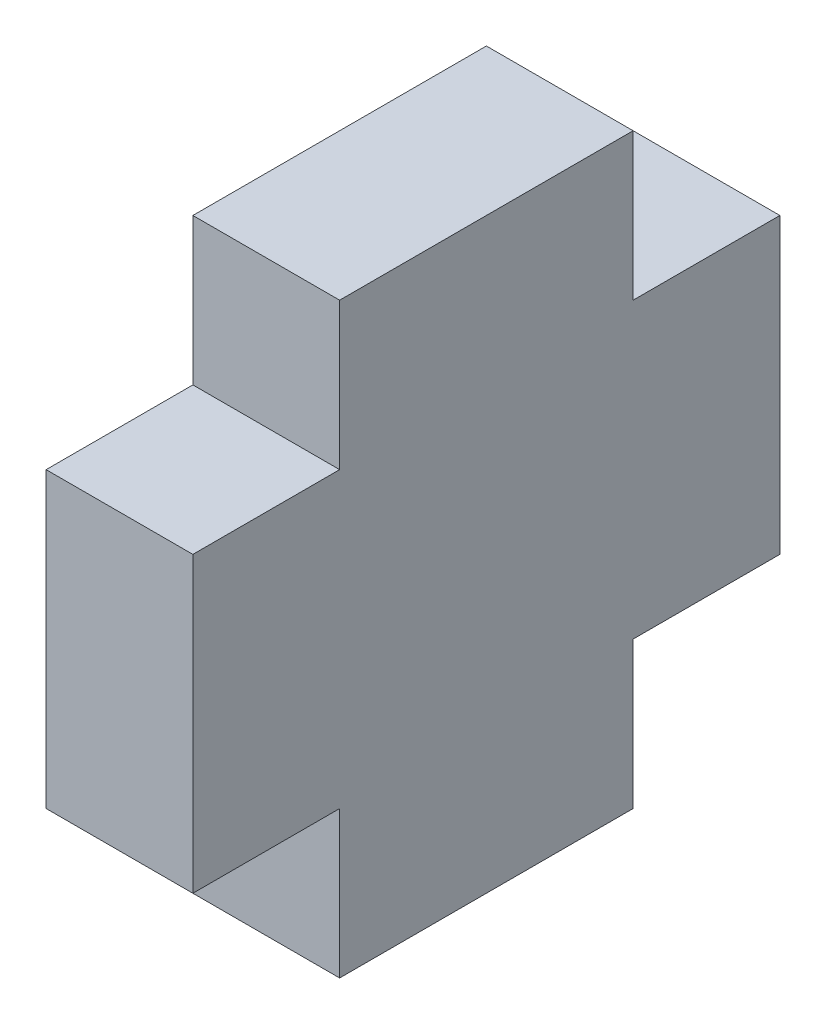
ISO-10303-21;
HEADER;
FILE_DESCRIPTION(('STEP AP214'),'2;1');
FILE_NAME('part.step','',(''),(''),'','','');
FILE_SCHEMA(('AUTOMOTIVE_DESIGN { 1 0 10303 214 1 1 1 1 }'));
ENDSEC;
DATA;
#1=APPLICATION_CONTEXT('core data for automotive mechanical design processes');
#2=APPLICATION_PROTOCOL_DEFINITION('international standard','automotive_design',2000,#1);
#3=PRODUCT_CONTEXT('',#1,'mechanical');
#4=PRODUCT('Part','Part','',(#3));
#5=PRODUCT_RELATED_PRODUCT_CATEGORY('part','',(#4));
#6=PRODUCT_DEFINITION_FORMATION('','',#4);
#7=PRODUCT_DEFINITION_CONTEXT('part definition',#1,'design');
#8=PRODUCT_DEFINITION('design','',#6,#7);
#9=PRODUCT_DEFINITION_SHAPE('','',#8);
#10=(LENGTH_UNIT() NAMED_UNIT(*) SI_UNIT(.MILLI.,.METRE.));
#11=(NAMED_UNIT(*) PLANE_ANGLE_UNIT() SI_UNIT($,.RADIAN.));
#12=(NAMED_UNIT(*) SI_UNIT($,.STERADIAN.) SOLID_ANGLE_UNIT());
#13=UNCERTAINTY_MEASURE_WITH_UNIT(LENGTH_MEASURE(1.E-05),#10,'distance_accuracy_value','');
#14=(GEOMETRIC_REPRESENTATION_CONTEXT(3) GLOBAL_UNCERTAINTY_ASSIGNED_CONTEXT((#13)) GLOBAL_UNIT_ASSIGNED_CONTEXT((#10,
#11,#12)) REPRESENTATION_CONTEXT('',''));
#15=CARTESIAN_POINT('',(0.,0.,0.));
#16=DIRECTION('',(0.,0.,1.));
#17=DIRECTION('',(1.,0.,0.));
#18=AXIS2_PLACEMENT_3D('',#15,#16,#17);
#19=CARTESIAN_POINT('',(10.,20.,10.));
#20=DIRECTION('',(0.,0.,-1.));
#21=DIRECTION('',(0.,1.,0.));
#22=AXIS2_PLACEMENT_3D('',#19,#20,#21);
#23=PLANE('',#22);
#24=DIRECTION('',(0.,-1.,0.));
#25=VECTOR('',#24,1.);
#26=CARTESIAN_POINT('',(0.,20.,10.));
#27=LINE('',#26,#25);
#28=CARTESIAN_POINT('',(0.,20.,10.));
#29=VERTEX_POINT('',#28);
#30=CARTESIAN_POINT('',(0.,9.99999999999999,10.));
#31=VERTEX_POINT('',#30);
#32=EDGE_CURVE('E164',#29,#31,#27,.T.);
#33=ORIENTED_EDGE('',*,*,#32,.T.);
#34=DIRECTION('',(-1.,0.,0.));
#35=VECTOR('',#34,1.);
#36=CARTESIAN_POINT('',(10.,9.99999999999999,10.));
#37=LINE('',#36,#35);
#38=CARTESIAN_POINT('',(10.,9.99999999999999,10.));
#39=VERTEX_POINT('',#38);
#40=EDGE_CURVE('E11',#39,#31,#37,.T.);
#41=ORIENTED_EDGE('',*,*,#40,.F.);
#42=DIRECTION('',(0.,-1.,0.));
#43=VECTOR('',#42,1.);
#44=CARTESIAN_POINT('',(10.,20.,10.));
#45=LINE('',#44,#43);
#46=CARTESIAN_POINT('',(10.,20.,10.));
#47=VERTEX_POINT('',#46);
#48=EDGE_CURVE('E198',#47,#39,#45,.T.);
#49=ORIENTED_EDGE('',*,*,#48,.F.);
#50=DIRECTION('',(-1.,0.,0.));
#51=VECTOR('',#50,1.);
#52=CARTESIAN_POINT('',(10.,20.,10.));
#53=LINE('',#52,#51);
#54=EDGE_CURVE('E160',#47,#29,#53,.T.);
#55=ORIENTED_EDGE('',*,*,#54,.T.);
#56=EDGE_LOOP('',(#33,#41,#49,#55));
#57=FACE_BOUND('',#56,.T.);
#58=ADVANCED_FACE('F39',(#57),#23,.F.);
#59=CARTESIAN_POINT('',(10.,9.99999999999999,10.));
#60=DIRECTION('',(0.,-1.,0.));
#61=DIRECTION('',(0.,0.,-1.));
#62=AXIS2_PLACEMENT_3D('',#59,#60,#61);
#63=PLANE('',#62);
#64=DIRECTION('',(0.,0.,1.));
#65=VECTOR('',#64,1.);
#66=CARTESIAN_POINT('',(0.,9.99999999999999,10.));
#67=LINE('',#66,#65);
#68=CARTESIAN_POINT('',(0.,9.99999999999999,20.));
#69=VERTEX_POINT('',#68);
#70=EDGE_CURVE('E168',#31,#69,#67,.T.);
#71=ORIENTED_EDGE('',*,*,#70,.T.);
#72=DIRECTION('',(-1.,0.,0.));
#73=VECTOR('',#72,1.);
#74=CARTESIAN_POINT('',(10.,9.99999999999999,20.));
#75=LINE('',#74,#73);
#76=CARTESIAN_POINT('',(10.,9.99999999999999,20.));
#77=VERTEX_POINT('',#76);
#78=EDGE_CURVE('E48',#77,#69,#75,.T.);
#79=ORIENTED_EDGE('',*,*,#78,.F.);
#80=DIRECTION('',(0.,0.,1.));
#81=VECTOR('',#80,1.);
#82=CARTESIAN_POINT('',(10.,9.99999999999999,10.));
#83=LINE('',#82,#81);
#84=EDGE_CURVE('E111',#39,#77,#83,.T.);
#85=ORIENTED_EDGE('',*,*,#84,.F.);
#86=ORIENTED_EDGE('',*,*,#40,.T.);
#87=EDGE_LOOP('',(#71,#79,#85,#86));
#88=FACE_BOUND('',#87,.T.);
#89=ADVANCED_FACE('F292',(#88),#63,.F.);
#90=CARTESIAN_POINT('',(10.,9.99999999999999,20.));
#91=DIRECTION('',(0.,0.,-1.));
#92=DIRECTION('',(-1.,0.,0.));
#93=AXIS2_PLACEMENT_3D('',#90,#91,#92);
#94=PLANE('',#93);
#95=DIRECTION('',(0.,-1.,0.));
#96=VECTOR('',#95,1.);
#97=CARTESIAN_POINT('',(0.,9.99999999999999,20.));
#98=LINE('',#97,#96);
#99=CARTESIAN_POINT('',(0.,-9.99999999999999,20.));
#100=VERTEX_POINT('',#99);
#101=EDGE_CURVE('E171',#69,#100,#98,.T.);
#102=ORIENTED_EDGE('',*,*,#101,.T.);
#103=DIRECTION('',(-1.,0.,0.));
#104=VECTOR('',#103,1.);
#105=CARTESIAN_POINT('',(10.,-9.99999999999999,20.));
#106=LINE('',#105,#104);
#107=CARTESIAN_POINT('',(10.,-9.99999999999999,20.));
#108=VERTEX_POINT('',#107);
#109=EDGE_CURVE('E225',#108,#100,#106,.T.);
#110=ORIENTED_EDGE('',*,*,#109,.F.);
#111=DIRECTION('',(0.,-1.,0.));
#112=VECTOR('',#111,1.);
#113=CARTESIAN_POINT('',(10.,9.99999999999999,20.));
#114=LINE('',#113,#112);
#115=EDGE_CURVE('E235',#77,#108,#114,.T.);
#116=ORIENTED_EDGE('',*,*,#115,.F.);
#117=ORIENTED_EDGE('',*,*,#78,.T.);
#118=EDGE_LOOP('',(#102,#110,#116,#117));
#119=FACE_BOUND('',#118,.T.);
#120=ADVANCED_FACE('F233',(#119),#94,.F.);
#121=CARTESIAN_POINT('',(10.,-9.99999999999999,10.));
#122=DIRECTION('',(0.,1.,0.));
#123=DIRECTION('',(0.,0.,1.));
#124=AXIS2_PLACEMENT_3D('',#121,#122,#123);
#125=PLANE('',#124);
#126=DIRECTION('',(0.,0.,-1.));
#127=VECTOR('',#126,1.);
#128=CARTESIAN_POINT('',(0.,-9.99999999999999,10.));
#129=LINE('',#128,#127);
#130=CARTESIAN_POINT('',(0.,-9.99999999999999,10.));
#131=VERTEX_POINT('',#130);
#132=EDGE_CURVE('E174',#100,#131,#129,.T.);
#133=ORIENTED_EDGE('',*,*,#132,.T.);
#134=DIRECTION('',(-1.,0.,0.));
#135=VECTOR('',#134,1.);
#136=CARTESIAN_POINT('',(10.,-9.99999999999999,10.));
#137=LINE('',#136,#135);
#138=CARTESIAN_POINT('',(10.,-9.99999999999999,10.));
#139=VERTEX_POINT('',#138);
#140=EDGE_CURVE('E221',#139,#131,#137,.T.);
#141=ORIENTED_EDGE('',*,*,#140,.F.);
#142=DIRECTION('',(0.,0.,-1.));
#143=VECTOR('',#142,1.);
#144=CARTESIAN_POINT('',(10.,-9.99999999999999,10.));
#145=LINE('',#144,#143);
#146=EDGE_CURVE('E254',#108,#139,#145,.T.);
#147=ORIENTED_EDGE('',*,*,#146,.F.);
#148=ORIENTED_EDGE('',*,*,#109,.T.);
#149=EDGE_LOOP('',(#133,#141,#147,#148));
#150=FACE_BOUND('',#149,.T.);
#151=ADVANCED_FACE('F244',(#150),#125,.F.);
#152=CARTESIAN_POINT('',(10.,-20.,10.));
#153=DIRECTION('',(0.,0.,-1.));
#154=DIRECTION('',(0.,1.,0.));
#155=AXIS2_PLACEMENT_3D('',#152,#153,#154);
#156=PLANE('',#155);
#157=DIRECTION('',(0.,-1.,0.));
#158=VECTOR('',#157,1.);
#159=CARTESIAN_POINT('',(0.,-20.,10.));
#160=LINE('',#159,#158);
#161=CARTESIAN_POINT('',(0.,-20.,10.));
#162=VERTEX_POINT('',#161);
#163=EDGE_CURVE('E177',#131,#162,#160,.T.);
#164=ORIENTED_EDGE('',*,*,#163,.T.);
#165=DIRECTION('',(-1.,0.,0.));
#166=VECTOR('',#165,1.);
#167=CARTESIAN_POINT('',(10.,-20.,10.));
#168=LINE('',#167,#166);
#169=CARTESIAN_POINT('',(10.,-20.,10.));
#170=VERTEX_POINT('',#169);
#171=EDGE_CURVE('E217',#170,#162,#168,.T.);
#172=ORIENTED_EDGE('',*,*,#171,.F.);
#173=DIRECTION('',(0.,-1.,0.));
#174=VECTOR('',#173,1.);
#175=CARTESIAN_POINT('',(10.,-20.,10.));
#176=LINE('',#175,#174);
#177=EDGE_CURVE('E250',#139,#170,#176,.T.);
#178=ORIENTED_EDGE('',*,*,#177,.F.);
#179=ORIENTED_EDGE('',*,*,#140,.T.);
#180=EDGE_LOOP('',(#164,#172,#178,#179));
#181=FACE_BOUND('',#180,.T.);
#182=ADVANCED_FACE('F248',(#181),#156,.F.);
#183=CARTESIAN_POINT('',(10.,-20.,-10.));
#184=DIRECTION('',(0.,1.,0.));
#185=DIRECTION('',(0.,0.,1.));
#186=AXIS2_PLACEMENT_3D('',#183,#184,#185);
#187=PLANE('',#186);
#188=DIRECTION('',(0.,0.,-1.));
#189=VECTOR('',#188,1.);
#190=CARTESIAN_POINT('',(0.,-20.,-10.));
#191=LINE('',#190,#189);
#192=CARTESIAN_POINT('',(0.,-20.,-10.));
#193=VERTEX_POINT('',#192);
#194=EDGE_CURVE('E180',#162,#193,#191,.T.);
#195=ORIENTED_EDGE('',*,*,#194,.T.);
#196=DIRECTION('',(-1.,0.,0.));
#197=VECTOR('',#196,1.);
#198=CARTESIAN_POINT('',(10.,-20.,-10.));
#199=LINE('',#198,#197);
#200=CARTESIAN_POINT('',(10.,-20.,-10.));
#201=VERTEX_POINT('',#200);
#202=EDGE_CURVE('E213',#201,#193,#199,.T.);
#203=ORIENTED_EDGE('',*,*,#202,.F.);
#204=DIRECTION('',(0.,0.,-1.));
#205=VECTOR('',#204,1.);
#206=CARTESIAN_POINT('',(10.,-20.,-10.));
#207=LINE('',#206,#205);
#208=EDGE_CURVE('E253',#170,#201,#207,.T.);
#209=ORIENTED_EDGE('',*,*,#208,.F.);
#210=ORIENTED_EDGE('',*,*,#171,.T.);
#211=EDGE_LOOP('',(#195,#203,#209,#210));
#212=FACE_BOUND('',#211,.T.);
#213=ADVANCED_FACE('F305',(#212),#187,.F.);
#214=CARTESIAN_POINT('',(10.,-20.,-10.));
#215=DIRECTION('',(0.,0.,1.));
#216=DIRECTION('',(0.,-1.,0.));
#217=AXIS2_PLACEMENT_3D('',#214,#215,#216);
#218=PLANE('',#217);
#219=DIRECTION('',(0.,1.,0.));
#220=VECTOR('',#219,1.);
#221=CARTESIAN_POINT('',(0.,-20.,-10.));
#222=LINE('',#221,#220);
#223=CARTESIAN_POINT('',(0.,-9.99999999999999,-10.));
#224=VERTEX_POINT('',#223);
#225=EDGE_CURVE('E183',#193,#224,#222,.T.);
#226=ORIENTED_EDGE('',*,*,#225,.T.);
#227=DIRECTION('',(-1.,0.,0.));
#228=VECTOR('',#227,1.);
#229=CARTESIAN_POINT('',(10.,-9.99999999999999,-10.));
#230=LINE('',#229,#228);
#231=CARTESIAN_POINT('',(10.,-9.99999999999999,-10.));
#232=VERTEX_POINT('',#231);
#233=EDGE_CURVE('E209',#232,#224,#230,.T.);
#234=ORIENTED_EDGE('',*,*,#233,.F.);
#235=DIRECTION('',(0.,1.,0.));
#236=VECTOR('',#235,1.);
#237=CARTESIAN_POINT('',(10.,-20.,-10.));
#238=LINE('',#237,#236);
#239=EDGE_CURVE('E258',#201,#232,#238,.T.);
#240=ORIENTED_EDGE('',*,*,#239,.F.);
#241=ORIENTED_EDGE('',*,*,#202,.T.);
#242=EDGE_LOOP('',(#226,#234,#240,#241));
#243=FACE_BOUND('',#242,.T.);
#244=ADVANCED_FACE('F308',(#243),#218,.F.);
#245=CARTESIAN_POINT('',(10.,-9.99999999999999,-10.));
#246=DIRECTION('',(0.,1.,0.));
#247=DIRECTION('',(0.,0.,1.));
#248=AXIS2_PLACEMENT_3D('',#245,#246,#247);
#249=PLANE('',#248);
#250=DIRECTION('',(0.,0.,-1.));
#251=VECTOR('',#250,1.);
#252=CARTESIAN_POINT('',(0.,-9.99999999999999,-10.));
#253=LINE('',#252,#251);
#254=CARTESIAN_POINT('',(0.,-9.99999999999999,-20.));
#255=VERTEX_POINT('',#254);
#256=EDGE_CURVE('E186',#224,#255,#253,.T.);
#257=ORIENTED_EDGE('',*,*,#256,.T.);
#258=DIRECTION('',(-1.,0.,0.));
#259=VECTOR('',#258,1.);
#260=CARTESIAN_POINT('',(10.,-9.99999999999999,-20.));
#261=LINE('',#260,#259);
#262=CARTESIAN_POINT('',(10.,-9.99999999999999,-20.));
#263=VERTEX_POINT('',#262);
#264=EDGE_CURVE('E205',#263,#255,#261,.T.);
#265=ORIENTED_EDGE('',*,*,#264,.F.);
#266=DIRECTION('',(0.,0.,-1.));
#267=VECTOR('',#266,1.);
#268=CARTESIAN_POINT('',(10.,-9.99999999999999,-10.));
#269=LINE('',#268,#267);
#270=EDGE_CURVE('E265',#232,#263,#269,.T.);
#271=ORIENTED_EDGE('',*,*,#270,.F.);
#272=ORIENTED_EDGE('',*,*,#233,.T.);
#273=EDGE_LOOP('',(#257,#265,#271,#272));
#274=FACE_BOUND('',#273,.T.);
#275=ADVANCED_FACE('F273',(#274),#249,.F.);
#276=CARTESIAN_POINT('',(10.,9.99999999999999,-20.));
#277=DIRECTION('',(0.,0.,1.));
#278=DIRECTION('',(1.,0.,0.));
#279=AXIS2_PLACEMENT_3D('',#276,#277,#278);
#280=PLANE('',#279);
#281=DIRECTION('',(0.,1.,0.));
#282=VECTOR('',#281,1.);
#283=CARTESIAN_POINT('',(0.,9.99999999999999,-20.));
#284=LINE('',#283,#282);
#285=CARTESIAN_POINT('',(0.,9.99999999999999,-20.));
#286=VERTEX_POINT('',#285);
#287=EDGE_CURVE('E189',#255,#286,#284,.T.);
#288=ORIENTED_EDGE('',*,*,#287,.T.);
#289=DIRECTION('',(-1.,0.,0.));
#290=VECTOR('',#289,1.);
#291=CARTESIAN_POINT('',(10.,9.99999999999999,-20.));
#292=LINE('',#291,#290);
#293=CARTESIAN_POINT('',(10.,9.99999999999999,-20.));
#294=VERTEX_POINT('',#293);
#295=EDGE_CURVE('E153',#294,#286,#292,.T.);
#296=ORIENTED_EDGE('',*,*,#295,.F.);
#297=DIRECTION('',(0.,1.,0.));
#298=VECTOR('',#297,1.);
#299=CARTESIAN_POINT('',(10.,9.99999999999999,-20.));
#300=LINE('',#299,#298);
#301=EDGE_CURVE('E142',#263,#294,#300,.T.);
#302=ORIENTED_EDGE('',*,*,#301,.F.);
#303=ORIENTED_EDGE('',*,*,#264,.T.);
#304=EDGE_LOOP('',(#288,#296,#302,#303));
#305=FACE_BOUND('',#304,.T.);
#306=ADVANCED_FACE('F277',(#305),#280,.F.);
#307=CARTESIAN_POINT('',(10.,9.99999999999999,-10.));
#308=DIRECTION('',(0.,-1.,0.));
#309=DIRECTION('',(0.,0.,-1.));
#310=AXIS2_PLACEMENT_3D('',#307,#308,#309);
#311=PLANE('',#310);
#312=DIRECTION('',(0.,0.,1.));
#313=VECTOR('',#312,1.);
#314=CARTESIAN_POINT('',(0.,9.99999999999999,-10.));
#315=LINE('',#314,#313);
#316=CARTESIAN_POINT('',(0.,9.99999999999999,-10.));
#317=VERTEX_POINT('',#316);
#318=EDGE_CURVE('E151',#286,#317,#315,.T.);
#319=ORIENTED_EDGE('',*,*,#318,.T.);
#320=DIRECTION('',(-1.,0.,0.));
#321=VECTOR('',#320,1.);
#322=CARTESIAN_POINT('',(10.,9.99999999999999,-10.));
#323=LINE('',#322,#321);
#324=CARTESIAN_POINT('',(10.,9.99999999999999,-10.));
#325=VERTEX_POINT('',#324);
#326=EDGE_CURVE('E148',#325,#317,#323,.T.);
#327=ORIENTED_EDGE('',*,*,#326,.F.);
#328=DIRECTION('',(0.,0.,1.));
#329=VECTOR('',#328,1.);
#330=CARTESIAN_POINT('',(10.,9.99999999999999,-10.));
#331=LINE('',#330,#329);
#332=EDGE_CURVE('E136',#294,#325,#331,.T.);
#333=ORIENTED_EDGE('',*,*,#332,.F.);
#334=ORIENTED_EDGE('',*,*,#295,.T.);
#335=EDGE_LOOP('',(#319,#327,#333,#334));
#336=FACE_BOUND('',#335,.T.);
#337=ADVANCED_FACE('F149',(#336),#311,.F.);
#338=CARTESIAN_POINT('',(10.,20.,-10.));
#339=DIRECTION('',(0.,0.,1.));
#340=DIRECTION('',(0.,-1.,0.));
#341=AXIS2_PLACEMENT_3D('',#338,#339,#340);
#342=PLANE('',#341);
#343=DIRECTION('',(0.,1.,0.));
#344=VECTOR('',#343,1.);
#345=CARTESIAN_POINT('',(0.,20.,-10.));
#346=LINE('',#345,#344);
#347=CARTESIAN_POINT('',(0.,20.,-10.));
#348=VERTEX_POINT('',#347);
#349=EDGE_CURVE('E97',#317,#348,#346,.T.);
#350=ORIENTED_EDGE('',*,*,#349,.T.);
#351=DIRECTION('',(-1.,0.,0.));
#352=VECTOR('',#351,1.);
#353=CARTESIAN_POINT('',(10.,20.,-10.));
#354=LINE('',#353,#352);
#355=CARTESIAN_POINT('',(10.,20.,-10.));
#356=VERTEX_POINT('',#355);
#357=EDGE_CURVE('E154',#356,#348,#354,.T.);
#358=ORIENTED_EDGE('',*,*,#357,.F.);
#359=DIRECTION('',(0.,1.,0.));
#360=VECTOR('',#359,1.);
#361=CARTESIAN_POINT('',(10.,20.,-10.));
#362=LINE('',#361,#360);
#363=EDGE_CURVE('E140',#325,#356,#362,.T.);
#364=ORIENTED_EDGE('',*,*,#363,.F.);
#365=ORIENTED_EDGE('',*,*,#326,.T.);
#366=EDGE_LOOP('',(#350,#358,#364,#365));
#367=FACE_BOUND('',#366,.T.);
#368=ADVANCED_FACE('F156',(#367),#342,.F.);
#369=CARTESIAN_POINT('',(10.,20.,-10.));
#370=DIRECTION('',(0.,-1.,0.));
#371=DIRECTION('',(0.,0.,-1.));
#372=AXIS2_PLACEMENT_3D('',#369,#370,#371);
#373=PLANE('',#372);
#374=DIRECTION('',(0.,0.,1.));
#375=VECTOR('',#374,1.);
#376=CARTESIAN_POINT('',(0.,20.,-10.));
#377=LINE('',#376,#375);
#378=EDGE_CURVE('E103',#348,#29,#377,.T.);
#379=ORIENTED_EDGE('',*,*,#378,.T.);
#380=ORIENTED_EDGE('',*,*,#54,.F.);
#381=DIRECTION('',(0.,0.,1.));
#382=VECTOR('',#381,1.);
#383=CARTESIAN_POINT('',(10.,20.,-10.));
#384=LINE('',#383,#382);
#385=EDGE_CURVE('E56',#356,#47,#384,.T.);
#386=ORIENTED_EDGE('',*,*,#385,.F.);
#387=ORIENTED_EDGE('',*,*,#357,.T.);
#388=EDGE_LOOP('',(#379,#380,#386,#387));
#389=FACE_BOUND('',#388,.T.);
#390=ADVANCED_FACE('F281',(#389),#373,.F.);
#391=CARTESIAN_POINT('',(10.,0.,0.));
#392=DIRECTION('',(-1.,0.,0.));
#393=DIRECTION('',(0.,0.,1.));
#394=AXIS2_PLACEMENT_3D('',#391,#392,#393);
#395=PLANE('',#394);
#396=ORIENTED_EDGE('',*,*,#48,.T.);
#397=ORIENTED_EDGE('',*,*,#84,.T.);
#398=ORIENTED_EDGE('',*,*,#115,.T.);
#399=ORIENTED_EDGE('',*,*,#146,.T.);
#400=ORIENTED_EDGE('',*,*,#177,.T.);
#401=ORIENTED_EDGE('',*,*,#208,.T.);
#402=ORIENTED_EDGE('',*,*,#239,.T.);
#403=ORIENTED_EDGE('',*,*,#270,.T.);
#404=ORIENTED_EDGE('',*,*,#301,.T.);
#405=ORIENTED_EDGE('',*,*,#332,.T.);
#406=ORIENTED_EDGE('',*,*,#363,.T.);
#407=ORIENTED_EDGE('',*,*,#385,.T.);
#408=EDGE_LOOP('',(#396,#397,#398,#399,#400,#401,#402,#403,#404,#405,#406,#407));
#409=FACE_BOUND('',#408,.T.);
#410=ADVANCED_FACE('F138',(#409),#395,.F.);
#411=CARTESIAN_POINT('',(0.,0.,0.));
#412=DIRECTION('',(-1.,0.,0.));
#413=DIRECTION('',(0.,0.,1.));
#414=AXIS2_PLACEMENT_3D('',#411,#412,#413);
#415=PLANE('',#414);
#416=ORIENTED_EDGE('',*,*,#32,.F.);
#417=ORIENTED_EDGE('',*,*,#378,.F.);
#418=ORIENTED_EDGE('',*,*,#349,.F.);
#419=ORIENTED_EDGE('',*,*,#318,.F.);
#420=ORIENTED_EDGE('',*,*,#287,.F.);
#421=ORIENTED_EDGE('',*,*,#256,.F.);
#422=ORIENTED_EDGE('',*,*,#225,.F.);
#423=ORIENTED_EDGE('',*,*,#194,.F.);
#424=ORIENTED_EDGE('',*,*,#163,.F.);
#425=ORIENTED_EDGE('',*,*,#132,.F.);
#426=ORIENTED_EDGE('',*,*,#101,.F.);
#427=ORIENTED_EDGE('',*,*,#70,.F.);
#428=EDGE_LOOP('',(#416,#417,#418,#419,#420,#421,#422,#423,#424,#425,#426,#427));
#429=FACE_BOUND('',#428,.T.);
#430=ADVANCED_FACE('F239',(#429),#415,.T.);
#431=CLOSED_SHELL('',(#58,#89,#120,#151,#182,#213,#244,#275,#306,#337,#368,#390,#410,#430));
#432=MANIFOLD_SOLID_BREP('B2',#431);
#433=ADVANCED_BREP_SHAPE_REPRESENTATION('',(#18,#432),#14);
#434=SHAPE_DEFINITION_REPRESENTATION(#9,#433);
ENDSEC;
END-ISO-10303-21;
